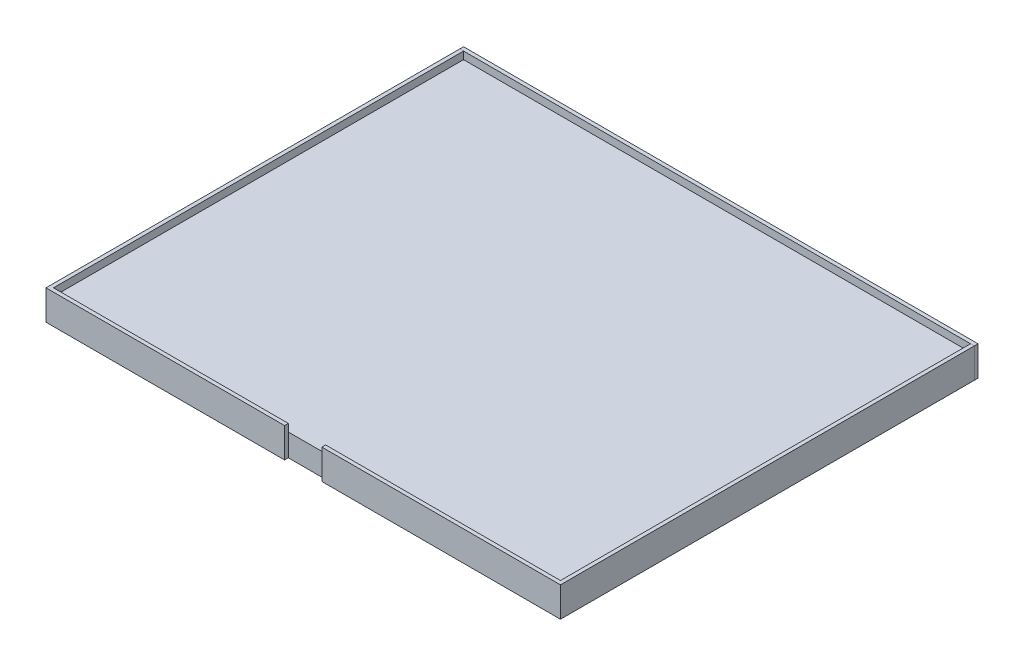
ISO-10303-21;
HEADER;
FILE_DESCRIPTION(('STEP AP214'),'2;1');
FILE_NAME('part.step','',(''),(''),'','','');
FILE_SCHEMA(('AUTOMOTIVE_DESIGN { 1 0 10303 214 1 1 1 1 }'));
ENDSEC;
DATA;
#1=APPLICATION_CONTEXT('core data for automotive mechanical design processes');
#2=APPLICATION_PROTOCOL_DEFINITION('international standard','automotive_design',2000,#1);
#3=PRODUCT_CONTEXT('',#1,'mechanical');
#4=PRODUCT('Part','Part','',(#3));
#5=PRODUCT_RELATED_PRODUCT_CATEGORY('part','',(#4));
#6=PRODUCT_DEFINITION_FORMATION('','',#4);
#7=PRODUCT_DEFINITION_CONTEXT('part definition',#1,'design');
#8=PRODUCT_DEFINITION('design','',#6,#7);
#9=PRODUCT_DEFINITION_SHAPE('','',#8);
#10=(LENGTH_UNIT() NAMED_UNIT(*) SI_UNIT(.MILLI.,.METRE.));
#11=(NAMED_UNIT(*) PLANE_ANGLE_UNIT() SI_UNIT($,.RADIAN.));
#12=(NAMED_UNIT(*) SI_UNIT($,.STERADIAN.) SOLID_ANGLE_UNIT());
#13=UNCERTAINTY_MEASURE_WITH_UNIT(LENGTH_MEASURE(1.E-05),#10,'distance_accuracy_value','');
#14=(GEOMETRIC_REPRESENTATION_CONTEXT(3) GLOBAL_UNCERTAINTY_ASSIGNED_CONTEXT((#13)) GLOBAL_UNIT_ASSIGNED_CONTEXT((#10,
#11,#12)) REPRESENTATION_CONTEXT('',''));
#15=CARTESIAN_POINT('',(0.,0.,0.));
#16=DIRECTION('',(0.,0.,1.));
#17=DIRECTION('',(1.,0.,0.));
#18=AXIS2_PLACEMENT_3D('',#15,#16,#17);
#19=CARTESIAN_POINT('',(434.975,25.4,-352.425));
#20=DIRECTION('',(-1.,0.,0.));
#21=DIRECTION('',(0.,0.,1.));
#22=AXIS2_PLACEMENT_3D('',#19,#20,#21);
#23=PLANE('',#22);
#24=DIRECTION('',(0.,-1.,0.));
#25=VECTOR('',#24,1.);
#26=CARTESIAN_POINT('',(434.975,25.4,-349.25));
#27=LINE('',#26,#25);
#28=CARTESIAN_POINT('',(434.975,25.4,-349.25));
#29=VERTEX_POINT('',#28);
#30=CARTESIAN_POINT('',(434.975,0.,-349.25));
#31=VERTEX_POINT('',#30);
#32=EDGE_CURVE('E127',#29,#31,#27,.T.);
#33=ORIENTED_EDGE('',*,*,#32,.T.);
#34=DIRECTION('',(0.,0.,1.));
#35=VECTOR('',#34,1.);
#36=CARTESIAN_POINT('',(434.975,0.,-352.425));
#37=LINE('',#36,#35);
#38=CARTESIAN_POINT('',(434.975,0.,-352.425));
#39=VERTEX_POINT('',#38);
#40=EDGE_CURVE('E12',#39,#31,#37,.T.);
#41=ORIENTED_EDGE('',*,*,#40,.F.);
#42=DIRECTION('',(0.,-1.,0.));
#43=VECTOR('',#42,1.);
#44=CARTESIAN_POINT('',(434.975,25.4,-352.425));
#45=LINE('',#44,#43);
#46=CARTESIAN_POINT('',(434.975,25.4,-352.425));
#47=VERTEX_POINT('',#46);
#48=EDGE_CURVE('E109',#47,#39,#45,.T.);
#49=ORIENTED_EDGE('',*,*,#48,.F.);
#50=DIRECTION('',(0.,0.,1.));
#51=VECTOR('',#50,1.);
#52=CARTESIAN_POINT('',(434.975,25.4,-352.425));
#53=LINE('',#52,#51);
#54=EDGE_CURVE('E123',#47,#29,#53,.T.);
#55=ORIENTED_EDGE('',*,*,#54,.T.);
#56=EDGE_LOOP('',(#33,#41,#49,#55));
#57=FACE_BOUND('',#56,.T.);
#58=ADVANCED_FACE('F49',(#57),#23,.F.);
#59=CARTESIAN_POINT('',(434.975,0.,-352.425));
#60=DIRECTION('',(0.,1.,0.));
#61=DIRECTION('',(0.,0.,1.));
#62=AXIS2_PLACEMENT_3D('',#59,#60,#61);
#63=PLANE('',#62);
#64=DIRECTION('',(-1.,0.,0.));
#65=VECTOR('',#64,1.);
#66=CARTESIAN_POINT('',(434.975,0.,-349.25));
#67=LINE('',#66,#65);
#68=CARTESIAN_POINT('',(-3.175,0.,-349.25));
#69=VERTEX_POINT('',#68);
#70=EDGE_CURVE('E114',#31,#69,#67,.T.);
#71=ORIENTED_EDGE('',*,*,#70,.T.);
#72=DIRECTION('',(0.,0.,1.));
#73=VECTOR('',#72,1.);
#74=CARTESIAN_POINT('',(-3.175,0.,-352.425));
#75=LINE('',#74,#73);
#76=CARTESIAN_POINT('',(-3.175,0.,-352.425));
#77=VERTEX_POINT('',#76);
#78=EDGE_CURVE('E58',#77,#69,#75,.T.);
#79=ORIENTED_EDGE('',*,*,#78,.F.);
#80=DIRECTION('',(-1.,0.,0.));
#81=VECTOR('',#80,1.);
#82=CARTESIAN_POINT('',(434.975,0.,-352.425));
#83=LINE('',#82,#81);
#84=EDGE_CURVE('E104',#39,#77,#83,.T.);
#85=ORIENTED_EDGE('',*,*,#84,.F.);
#86=ORIENTED_EDGE('',*,*,#40,.T.);
#87=EDGE_LOOP('',(#71,#79,#85,#86));
#88=FACE_BOUND('',#87,.T.);
#89=ADVANCED_FACE('F113',(#88),#63,.F.);
#90=CARTESIAN_POINT('',(-3.175,25.4,-352.425));
#91=DIRECTION('',(1.,0.,0.));
#92=DIRECTION('',(0.,0.,-1.));
#93=AXIS2_PLACEMENT_3D('',#90,#91,#92);
#94=PLANE('',#93);
#95=DIRECTION('',(0.,1.,0.));
#96=VECTOR('',#95,1.);
#97=CARTESIAN_POINT('',(-3.175,25.4,-349.25));
#98=LINE('',#97,#96);
#99=CARTESIAN_POINT('',(-3.175,25.4,-349.25));
#100=VERTEX_POINT('',#99);
#101=EDGE_CURVE('E90',#69,#100,#98,.T.);
#102=ORIENTED_EDGE('',*,*,#101,.T.);
#103=DIRECTION('',(0.,0.,1.));
#104=VECTOR('',#103,1.);
#105=CARTESIAN_POINT('',(-3.175,25.4,-352.425));
#106=LINE('',#105,#104);
#107=CARTESIAN_POINT('',(-3.175,25.4,-352.425));
#108=VERTEX_POINT('',#107);
#109=EDGE_CURVE('E116',#108,#100,#106,.T.);
#110=ORIENTED_EDGE('',*,*,#109,.F.);
#111=DIRECTION('',(0.,1.,0.));
#112=VECTOR('',#111,1.);
#113=CARTESIAN_POINT('',(-3.175,25.4,-352.425));
#114=LINE('',#113,#112);
#115=EDGE_CURVE('E107',#77,#108,#114,.T.);
#116=ORIENTED_EDGE('',*,*,#115,.F.);
#117=ORIENTED_EDGE('',*,*,#78,.T.);
#118=EDGE_LOOP('',(#102,#110,#116,#117));
#119=FACE_BOUND('',#118,.T.);
#120=ADVANCED_FACE('F117',(#119),#94,.F.);
#121=CARTESIAN_POINT('',(434.975,25.4,-352.425));
#122=DIRECTION('',(0.,-1.,0.));
#123=DIRECTION('',(0.,0.,-1.));
#124=AXIS2_PLACEMENT_3D('',#121,#122,#123);
#125=PLANE('',#124);
#126=DIRECTION('',(1.,0.,0.));
#127=VECTOR('',#126,1.);
#128=CARTESIAN_POINT('',(434.975,25.4,-349.25));
#129=LINE('',#128,#127);
#130=EDGE_CURVE('E97',#100,#29,#129,.T.);
#131=ORIENTED_EDGE('',*,*,#130,.T.);
#132=ORIENTED_EDGE('',*,*,#54,.F.);
#133=DIRECTION('',(1.,0.,0.));
#134=VECTOR('',#133,1.);
#135=CARTESIAN_POINT('',(434.975,25.4,-352.425));
#136=LINE('',#135,#134);
#137=EDGE_CURVE('E69',#108,#47,#136,.T.);
#138=ORIENTED_EDGE('',*,*,#137,.F.);
#139=ORIENTED_EDGE('',*,*,#109,.T.);
#140=EDGE_LOOP('',(#131,#132,#138,#139));
#141=FACE_BOUND('',#140,.T.);
#142=ADVANCED_FACE('F139',(#141),#125,.F.);
#143=CARTESIAN_POINT('',(0.,0.,-352.425));
#144=DIRECTION('',(0.,0.,-1.));
#145=DIRECTION('',(-1.,0.,0.));
#146=AXIS2_PLACEMENT_3D('',#143,#144,#145);
#147=PLANE('',#146);
#148=ORIENTED_EDGE('',*,*,#48,.T.);
#149=ORIENTED_EDGE('',*,*,#84,.T.);
#150=ORIENTED_EDGE('',*,*,#115,.T.);
#151=ORIENTED_EDGE('',*,*,#137,.T.);
#152=EDGE_LOOP('',(#148,#149,#150,#151));
#153=FACE_BOUND('',#152,.T.);
#154=ADVANCED_FACE('F105',(#153),#147,.T.);
#155=CARTESIAN_POINT('',(0.,0.,-349.25));
#156=DIRECTION('',(0.,0.,-1.));
#157=DIRECTION('',(-1.,0.,0.));
#158=AXIS2_PLACEMENT_3D('',#155,#156,#157);
#159=PLANE('',#158);
#160=ORIENTED_EDGE('',*,*,#32,.F.);
#161=ORIENTED_EDGE('',*,*,#130,.F.);
#162=ORIENTED_EDGE('',*,*,#101,.F.);
#163=ORIENTED_EDGE('',*,*,#70,.F.);
#164=EDGE_LOOP('',(#160,#161,#162,#163));
#165=FACE_BOUND('',#164,.T.);
#166=ADVANCED_FACE('F142',(#165),#159,.F.);
#167=CLOSED_SHELL('',(#58,#89,#120,#142,#154,#166));
#168=MANIFOLD_SOLID_BREP('B2',#167);
#169=CARTESIAN_POINT('',(-3.175,25.4,3.175));
#170=DIRECTION('',(0.,0.,1.));
#171=DIRECTION('',(1.,0.,0.));
#172=AXIS2_PLACEMENT_3D('',#169,#170,#171);
#173=PLANE('',#172);
#174=DIRECTION('',(0.,1.,0.));
#175=VECTOR('',#174,1.);
#176=CARTESIAN_POINT('',(231.775,0.,3.175));
#177=LINE('',#176,#175);
#178=CARTESIAN_POINT('',(231.775,0.,3.175));
#179=VERTEX_POINT('',#178);
#180=CARTESIAN_POINT('',(231.775,25.4,3.175));
#181=VERTEX_POINT('',#180);
#182=EDGE_CURVE('E216',#179,#181,#177,.T.);
#183=ORIENTED_EDGE('',*,*,#182,.F.);
#184=DIRECTION('',(-1.,0.,0.));
#185=VECTOR('',#184,1.);
#186=CARTESIAN_POINT('',(-3.175,0.,3.175));
#187=LINE('',#186,#185);
#188=CARTESIAN_POINT('',(434.975,0.,3.175));
#189=VERTEX_POINT('',#188);
#190=EDGE_CURVE('E290',#189,#179,#187,.T.);
#191=ORIENTED_EDGE('',*,*,#190,.F.);
#192=DIRECTION('',(0.,-1.,0.));
#193=VECTOR('',#192,1.);
#194=CARTESIAN_POINT('',(434.975,25.4,3.175));
#195=LINE('',#194,#193);
#196=CARTESIAN_POINT('',(434.975,25.4,3.175));
#197=VERTEX_POINT('',#196);
#198=EDGE_CURVE('E275',#197,#189,#195,.T.);
#199=ORIENTED_EDGE('',*,*,#198,.F.);
#200=DIRECTION('',(-1.,0.,0.));
#201=VECTOR('',#200,1.);
#202=CARTESIAN_POINT('',(-3.175,25.4,3.175));
#203=LINE('',#202,#201);
#204=EDGE_CURVE('E324',#197,#181,#203,.T.);
#205=ORIENTED_EDGE('',*,*,#204,.T.);
#206=EDGE_LOOP('',(#183,#191,#199,#205));
#207=FACE_BOUND('',#206,.T.);
#208=ADVANCED_FACE('F206',(#207),#173,.T.);
#209=CARTESIAN_POINT('',(0.,25.4,0.));
#210=DIRECTION('',(0.,0.,-1.));
#211=DIRECTION('',(-1.,0.,0.));
#212=AXIS2_PLACEMENT_3D('',#209,#210,#211);
#213=PLANE('',#212);
#214=DIRECTION('',(0.,1.,0.));
#215=VECTOR('',#214,1.);
#216=CARTESIAN_POINT('',(231.775,0.,0.));
#217=LINE('',#216,#215);
#218=CARTESIAN_POINT('',(231.775,0.,0.));
#219=VERTEX_POINT('',#218);
#220=CARTESIAN_POINT('',(231.775,25.4,0.));
#221=VERTEX_POINT('',#220);
#222=EDGE_CURVE('E319',#219,#221,#217,.T.);
#223=ORIENTED_EDGE('',*,*,#222,.T.);
#224=DIRECTION('',(1.,0.,0.));
#225=VECTOR('',#224,1.);
#226=CARTESIAN_POINT('',(0.,25.4,0.));
#227=LINE('',#226,#225);
#228=CARTESIAN_POINT('',(431.8,25.4,0.));
#229=VERTEX_POINT('',#228);
#230=EDGE_CURVE('E323',#221,#229,#227,.T.);
#231=ORIENTED_EDGE('',*,*,#230,.T.);
#232=DIRECTION('',(0.,-1.,0.));
#233=VECTOR('',#232,1.);
#234=CARTESIAN_POINT('',(431.8,25.4,0.));
#235=LINE('',#234,#233);
#236=CARTESIAN_POINT('',(431.8,0.,0.));
#237=VERTEX_POINT('',#236);
#238=EDGE_CURVE('E315',#229,#237,#235,.T.);
#239=ORIENTED_EDGE('',*,*,#238,.T.);
#240=DIRECTION('',(1.,0.,0.));
#241=VECTOR('',#240,1.);
#242=CARTESIAN_POINT('',(0.,0.,0.));
#243=LINE('',#242,#241);
#244=EDGE_CURVE('E209',#219,#237,#243,.T.);
#245=ORIENTED_EDGE('',*,*,#244,.F.);
#246=EDGE_LOOP('',(#223,#231,#239,#245));
#247=FACE_BOUND('',#246,.T.);
#248=ADVANCED_FACE('F345',(#247),#213,.T.);
#249=CARTESIAN_POINT('',(0.,25.4,0.));
#250=DIRECTION('',(0.,1.,0.));
#251=DIRECTION('',(0.,0.,1.));
#252=AXIS2_PLACEMENT_3D('',#249,#250,#251);
#253=PLANE('',#252);
#254=DIRECTION('',(0.,0.,1.));
#255=VECTOR('',#254,1.);
#256=CARTESIAN_POINT('',(231.775,25.4,0.));
#257=LINE('',#256,#255);
#258=EDGE_CURVE('E293',#221,#181,#257,.T.);
#259=ORIENTED_EDGE('',*,*,#258,.T.);
#260=ORIENTED_EDGE('',*,*,#204,.F.);
#261=DIRECTION('',(0.,0.,1.));
#262=VECTOR('',#261,1.);
#263=CARTESIAN_POINT('',(434.975,25.4,3.175));
#264=LINE('',#263,#262);
#265=CARTESIAN_POINT('',(434.975,25.4,-349.25));
#266=VERTEX_POINT('',#265);
#267=EDGE_CURVE('E282',#266,#197,#264,.T.);
#268=ORIENTED_EDGE('',*,*,#267,.F.);
#269=DIRECTION('',(1.,0.,0.));
#270=VECTOR('',#269,1.);
#271=CARTESIAN_POINT('',(431.8,25.4,-349.25));
#272=LINE('',#271,#270);
#273=CARTESIAN_POINT('',(431.8,25.4,-349.25));
#274=VERTEX_POINT('',#273);
#275=EDGE_CURVE('E287',#274,#266,#272,.T.);
#276=ORIENTED_EDGE('',*,*,#275,.F.);
#277=DIRECTION('',(0.,0.,-1.));
#278=VECTOR('',#277,1.);
#279=CARTESIAN_POINT('',(431.8,25.4,0.));
#280=LINE('',#279,#278);
#281=EDGE_CURVE('E312',#229,#274,#280,.T.);
#282=ORIENTED_EDGE('',*,*,#281,.F.);
#283=ORIENTED_EDGE('',*,*,#230,.F.);
#284=EDGE_LOOP('',(#259,#260,#268,#276,#282,#283));
#285=FACE_BOUND('',#284,.T.);
#286=ADVANCED_FACE('F342',(#285),#253,.T.);
#287=CARTESIAN_POINT('',(0.,0.,0.));
#288=DIRECTION('',(0.,1.,0.));
#289=DIRECTION('',(0.,0.,1.));
#290=AXIS2_PLACEMENT_3D('',#287,#288,#289);
#291=PLANE('',#290);
#292=ORIENTED_EDGE('',*,*,#190,.T.);
#293=DIRECTION('',(0.,0.,1.));
#294=VECTOR('',#293,1.);
#295=CARTESIAN_POINT('',(231.775,0.,0.));
#296=LINE('',#295,#294);
#297=EDGE_CURVE('E47',#219,#179,#296,.T.);
#298=ORIENTED_EDGE('',*,*,#297,.F.);
#299=ORIENTED_EDGE('',*,*,#244,.T.);
#300=DIRECTION('',(0.,0.,-1.));
#301=VECTOR('',#300,1.);
#302=CARTESIAN_POINT('',(431.8,0.,0.));
#303=LINE('',#302,#301);
#304=CARTESIAN_POINT('',(431.8,0.,-349.25));
#305=VERTEX_POINT('',#304);
#306=EDGE_CURVE('E304',#237,#305,#303,.T.);
#307=ORIENTED_EDGE('',*,*,#306,.T.);
#308=DIRECTION('',(1.,0.,0.));
#309=VECTOR('',#308,1.);
#310=CARTESIAN_POINT('',(431.8,0.,-349.25));
#311=LINE('',#310,#309);
#312=CARTESIAN_POINT('',(434.975,0.,-349.25));
#313=VERTEX_POINT('',#312);
#314=EDGE_CURVE('E296',#305,#313,#311,.T.);
#315=ORIENTED_EDGE('',*,*,#314,.T.);
#316=DIRECTION('',(0.,0.,1.));
#317=VECTOR('',#316,1.);
#318=CARTESIAN_POINT('',(434.975,0.,3.175));
#319=LINE('',#318,#317);
#320=EDGE_CURVE('E279',#313,#189,#319,.T.);
#321=ORIENTED_EDGE('',*,*,#320,.T.);
#322=EDGE_LOOP('',(#292,#298,#299,#307,#315,#321));
#323=FACE_BOUND('',#322,.T.);
#324=ADVANCED_FACE('F294',(#323),#291,.F.);
#325=CARTESIAN_POINT('',(434.975,25.4,3.175));
#326=DIRECTION('',(1.,0.,0.));
#327=DIRECTION('',(0.,0.,-1.));
#328=AXIS2_PLACEMENT_3D('',#325,#326,#327);
#329=PLANE('',#328);
#330=ORIENTED_EDGE('',*,*,#320,.F.);
#331=DIRECTION('',(0.,-1.,0.));
#332=VECTOR('',#331,1.);
#333=CARTESIAN_POINT('',(434.975,25.4,-349.25));
#334=LINE('',#333,#332);
#335=EDGE_CURVE('E311',#266,#313,#334,.T.);
#336=ORIENTED_EDGE('',*,*,#335,.F.);
#337=ORIENTED_EDGE('',*,*,#267,.T.);
#338=ORIENTED_EDGE('',*,*,#198,.T.);
#339=EDGE_LOOP('',(#330,#336,#337,#338));
#340=FACE_BOUND('',#339,.T.);
#341=ADVANCED_FACE('F277',(#340),#329,.T.);
#342=CARTESIAN_POINT('',(431.8,25.4,-349.25));
#343=DIRECTION('',(0.,0.,-1.));
#344=DIRECTION('',(-1.,0.,0.));
#345=AXIS2_PLACEMENT_3D('',#342,#343,#344);
#346=PLANE('',#345);
#347=ORIENTED_EDGE('',*,*,#314,.F.);
#348=DIRECTION('',(0.,-1.,0.));
#349=VECTOR('',#348,1.);
#350=CARTESIAN_POINT('',(431.8,25.4,-349.25));
#351=LINE('',#350,#349);
#352=EDGE_CURVE('E247',#274,#305,#351,.T.);
#353=ORIENTED_EDGE('',*,*,#352,.F.);
#354=ORIENTED_EDGE('',*,*,#275,.T.);
#355=ORIENTED_EDGE('',*,*,#335,.T.);
#356=EDGE_LOOP('',(#347,#353,#354,#355));
#357=FACE_BOUND('',#356,.T.);
#358=ADVANCED_FACE('F340',(#357),#346,.T.);
#359=CARTESIAN_POINT('',(431.8,25.4,0.));
#360=DIRECTION('',(-1.,0.,0.));
#361=DIRECTION('',(0.,0.,1.));
#362=AXIS2_PLACEMENT_3D('',#359,#360,#361);
#363=PLANE('',#362);
#364=ORIENTED_EDGE('',*,*,#306,.F.);
#365=ORIENTED_EDGE('',*,*,#238,.F.);
#366=ORIENTED_EDGE('',*,*,#281,.T.);
#367=ORIENTED_EDGE('',*,*,#352,.T.);
#368=EDGE_LOOP('',(#364,#365,#366,#367));
#369=FACE_BOUND('',#368,.T.);
#370=ADVANCED_FACE('F346',(#369),#363,.T.);
#371=CARTESIAN_POINT('',(231.775,0.,0.));
#372=DIRECTION('',(1.,0.,0.));
#373=DIRECTION('',(0.,1.,0.));
#374=AXIS2_PLACEMENT_3D('',#371,#372,#373);
#375=PLANE('',#374);
#376=ORIENTED_EDGE('',*,*,#182,.T.);
#377=ORIENTED_EDGE('',*,*,#258,.F.);
#378=ORIENTED_EDGE('',*,*,#222,.F.);
#379=ORIENTED_EDGE('',*,*,#297,.T.);
#380=EDGE_LOOP('',(#376,#377,#378,#379));
#381=FACE_BOUND('',#380,.T.);
#382=ADVANCED_FACE('F344',(#381),#375,.F.);
#383=CLOSED_SHELL('',(#208,#248,#286,#324,#341,#358,#370,#382));
#384=MANIFOLD_SOLID_BREP('B6',#383);
#385=CARTESIAN_POINT('',(0.,25.4,-349.25));
#386=DIRECTION('',(1.,0.,0.));
#387=DIRECTION('',(0.,0.,-1.));
#388=AXIS2_PLACEMENT_3D('',#385,#386,#387);
#389=PLANE('',#388);
#390=DIRECTION('',(0.,0.,1.));
#391=VECTOR('',#390,1.);
#392=CARTESIAN_POINT('',(0.,0.,-349.25));
#393=LINE('',#392,#391);
#394=CARTESIAN_POINT('',(0.,0.,-349.25));
#395=VERTEX_POINT('',#394);
#396=CARTESIAN_POINT('',(0.,0.,0.));
#397=VERTEX_POINT('',#396);
#398=EDGE_CURVE('E537',#395,#397,#393,.T.);
#399=ORIENTED_EDGE('',*,*,#398,.F.);
#400=DIRECTION('',(0.,-1.,0.));
#401=VECTOR('',#400,1.);
#402=CARTESIAN_POINT('',(0.,25.4,-349.25));
#403=LINE('',#402,#401);
#404=CARTESIAN_POINT('',(0.,25.4,-349.25));
#405=VERTEX_POINT('',#404);
#406=EDGE_CURVE('E429',#405,#395,#403,.T.);
#407=ORIENTED_EDGE('',*,*,#406,.F.);
#408=DIRECTION('',(0.,0.,1.));
#409=VECTOR('',#408,1.);
#410=CARTESIAN_POINT('',(0.,25.4,-349.25));
#411=LINE('',#410,#409);
#412=CARTESIAN_POINT('',(0.,25.4,0.));
#413=VERTEX_POINT('',#412);
#414=EDGE_CURVE('E520',#405,#413,#411,.T.);
#415=ORIENTED_EDGE('',*,*,#414,.T.);
#416=DIRECTION('',(0.,-1.,0.));
#417=VECTOR('',#416,1.);
#418=CARTESIAN_POINT('',(0.,25.4,0.));
#419=LINE('',#418,#417);
#420=EDGE_CURVE('E518',#413,#397,#419,.T.);
#421=ORIENTED_EDGE('',*,*,#420,.T.);
#422=EDGE_LOOP('',(#399,#407,#415,#421));
#423=FACE_BOUND('',#422,.T.);
#424=ADVANCED_FACE('F425',(#423),#389,.T.);
#425=CARTESIAN_POINT('',(0.,25.4,-349.25));
#426=DIRECTION('',(0.,0.,-1.));
#427=DIRECTION('',(-1.,0.,0.));
#428=AXIS2_PLACEMENT_3D('',#425,#426,#427);
#429=PLANE('',#428);
#430=DIRECTION('',(1.,0.,0.));
#431=VECTOR('',#430,1.);
#432=CARTESIAN_POINT('',(0.,0.,-349.25));
#433=LINE('',#432,#431);
#434=CARTESIAN_POINT('',(-3.175,0.,-349.25));
#435=VERTEX_POINT('',#434);
#436=EDGE_CURVE('E533',#435,#395,#433,.T.);
#437=ORIENTED_EDGE('',*,*,#436,.F.);
#438=DIRECTION('',(0.,-1.,0.));
#439=VECTOR('',#438,1.);
#440=CARTESIAN_POINT('',(-3.175,25.4,-349.25));
#441=LINE('',#440,#439);
#442=CARTESIAN_POINT('',(-3.175,25.4,-349.25));
#443=VERTEX_POINT('',#442);
#444=EDGE_CURVE('E204',#443,#435,#441,.T.);
#445=ORIENTED_EDGE('',*,*,#444,.F.);
#446=DIRECTION('',(1.,0.,0.));
#447=VECTOR('',#446,1.);
#448=CARTESIAN_POINT('',(0.,25.4,-349.25));
#449=LINE('',#448,#447);
#450=EDGE_CURVE('E527',#443,#405,#449,.T.);
#451=ORIENTED_EDGE('',*,*,#450,.T.);
#452=ORIENTED_EDGE('',*,*,#406,.T.);
#453=EDGE_LOOP('',(#437,#445,#451,#452));
#454=FACE_BOUND('',#453,.T.);
#455=ADVANCED_FACE('F427',(#454),#429,.T.);
#456=CARTESIAN_POINT('',(-3.175,25.4,-349.25));
#457=DIRECTION('',(-1.,0.,0.));
#458=DIRECTION('',(0.,0.,1.));
#459=AXIS2_PLACEMENT_3D('',#456,#457,#458);
#460=PLANE('',#459);
#461=DIRECTION('',(0.,0.,-1.));
#462=VECTOR('',#461,1.);
#463=CARTESIAN_POINT('',(-3.175,0.,-349.25));
#464=LINE('',#463,#462);
#465=CARTESIAN_POINT('',(-3.175,0.,3.175));
#466=VERTEX_POINT('',#465);
#467=EDGE_CURVE('E547',#466,#435,#464,.T.);
#468=ORIENTED_EDGE('',*,*,#467,.F.);
#469=DIRECTION('',(0.,-1.,0.));
#470=VECTOR('',#469,1.);
#471=CARTESIAN_POINT('',(-3.175,25.4,3.175));
#472=LINE('',#471,#470);
#473=CARTESIAN_POINT('',(-3.175,25.4,3.175));
#474=VERTEX_POINT('',#473);
#475=EDGE_CURVE('E435',#474,#466,#472,.T.);
#476=ORIENTED_EDGE('',*,*,#475,.F.);
#477=DIRECTION('',(0.,0.,-1.));
#478=VECTOR('',#477,1.);
#479=CARTESIAN_POINT('',(-3.175,25.4,-349.25));
#480=LINE('',#479,#478);
#481=EDGE_CURVE('E524',#474,#443,#480,.T.);
#482=ORIENTED_EDGE('',*,*,#481,.T.);
#483=ORIENTED_EDGE('',*,*,#444,.T.);
#484=EDGE_LOOP('',(#468,#476,#482,#483));
#485=FACE_BOUND('',#484,.T.);
#486=ADVANCED_FACE('F560',(#485),#460,.T.);
#487=CARTESIAN_POINT('',(0.,25.4,0.));
#488=DIRECTION('',(0.,1.,0.));
#489=DIRECTION('',(0.,0.,1.));
#490=AXIS2_PLACEMENT_3D('',#487,#488,#489);
#491=PLANE('',#490);
#492=DIRECTION('',(0.,0.,1.));
#493=VECTOR('',#492,1.);
#494=CARTESIAN_POINT('',(200.025,25.4,0.));
#495=LINE('',#494,#493);
#496=CARTESIAN_POINT('',(200.025,25.4,0.));
#497=VERTEX_POINT('',#496);
#498=CARTESIAN_POINT('',(200.025,25.4,3.175));
#499=VERTEX_POINT('',#498);
#500=EDGE_CURVE('E500',#497,#499,#495,.T.);
#501=ORIENTED_EDGE('',*,*,#500,.F.);
#502=DIRECTION('',(1.,0.,0.));
#503=VECTOR('',#502,1.);
#504=CARTESIAN_POINT('',(0.,25.4,0.));
#505=LINE('',#504,#503);
#506=EDGE_CURVE('E512',#413,#497,#505,.T.);
#507=ORIENTED_EDGE('',*,*,#506,.F.);
#508=ORIENTED_EDGE('',*,*,#414,.F.);
#509=ORIENTED_EDGE('',*,*,#450,.F.);
#510=ORIENTED_EDGE('',*,*,#481,.F.);
#511=DIRECTION('',(-1.,0.,0.));
#512=VECTOR('',#511,1.);
#513=CARTESIAN_POINT('',(-3.175,25.4,3.175));
#514=LINE('',#513,#512);
#515=EDGE_CURVE('E514',#499,#474,#514,.T.);
#516=ORIENTED_EDGE('',*,*,#515,.F.);
#517=EDGE_LOOP('',(#501,#507,#508,#509,#510,#516));
#518=FACE_BOUND('',#517,.T.);
#519=ADVANCED_FACE('F511',(#518),#491,.T.);
#520=CARTESIAN_POINT('',(0.,0.,0.));
#521=DIRECTION('',(0.,1.,0.));
#522=DIRECTION('',(0.,0.,1.));
#523=AXIS2_PLACEMENT_3D('',#520,#521,#522);
#524=PLANE('',#523);
#525=DIRECTION('',(1.,0.,0.));
#526=VECTOR('',#525,1.);
#527=CARTESIAN_POINT('',(0.,0.,0.));
#528=LINE('',#527,#526);
#529=CARTESIAN_POINT('',(200.025,0.,0.));
#530=VERTEX_POINT('',#529);
#531=EDGE_CURVE('E541',#397,#530,#528,.T.);
#532=ORIENTED_EDGE('',*,*,#531,.T.);
#533=DIRECTION('',(0.,0.,1.));
#534=VECTOR('',#533,1.);
#535=CARTESIAN_POINT('',(200.025,0.,0.));
#536=LINE('',#535,#534);
#537=CARTESIAN_POINT('',(200.025,0.,3.175));
#538=VERTEX_POINT('',#537);
#539=EDGE_CURVE('E501',#530,#538,#536,.T.);
#540=ORIENTED_EDGE('',*,*,#539,.T.);
#541=DIRECTION('',(-1.,0.,0.));
#542=VECTOR('',#541,1.);
#543=CARTESIAN_POINT('',(-3.175,0.,3.175));
#544=LINE('',#543,#542);
#545=EDGE_CURVE('E544',#538,#466,#544,.T.);
#546=ORIENTED_EDGE('',*,*,#545,.T.);
#547=ORIENTED_EDGE('',*,*,#467,.T.);
#548=ORIENTED_EDGE('',*,*,#436,.T.);
#549=ORIENTED_EDGE('',*,*,#398,.T.);
#550=EDGE_LOOP('',(#532,#540,#546,#547,#548,#549));
#551=FACE_BOUND('',#550,.T.);
#552=ADVANCED_FACE('F557',(#551),#524,.F.);
#553=CARTESIAN_POINT('',(0.,25.4,0.));
#554=DIRECTION('',(0.,0.,-1.));
#555=DIRECTION('',(-1.,0.,0.));
#556=AXIS2_PLACEMENT_3D('',#553,#554,#555);
#557=PLANE('',#556);
#558=DIRECTION('',(0.,-1.,0.));
#559=VECTOR('',#558,1.);
#560=CARTESIAN_POINT('',(200.025,0.,0.));
#561=LINE('',#560,#559);
#562=EDGE_CURVE('E497',#497,#530,#561,.T.);
#563=ORIENTED_EDGE('',*,*,#562,.T.);
#564=ORIENTED_EDGE('',*,*,#531,.F.);
#565=ORIENTED_EDGE('',*,*,#420,.F.);
#566=ORIENTED_EDGE('',*,*,#506,.T.);
#567=EDGE_LOOP('',(#563,#564,#565,#566));
#568=FACE_BOUND('',#567,.T.);
#569=ADVANCED_FACE('F517',(#568),#557,.T.);
#570=CARTESIAN_POINT('',(-3.175,25.4,3.175));
#571=DIRECTION('',(0.,0.,1.));
#572=DIRECTION('',(1.,0.,0.));
#573=AXIS2_PLACEMENT_3D('',#570,#571,#572);
#574=PLANE('',#573);
#575=DIRECTION('',(0.,-1.,0.));
#576=VECTOR('',#575,1.);
#577=CARTESIAN_POINT('',(200.025,0.,3.175));
#578=LINE('',#577,#576);
#579=EDGE_CURVE('E446',#499,#538,#578,.T.);
#580=ORIENTED_EDGE('',*,*,#579,.F.);
#581=ORIENTED_EDGE('',*,*,#515,.T.);
#582=ORIENTED_EDGE('',*,*,#475,.T.);
#583=ORIENTED_EDGE('',*,*,#545,.F.);
#584=EDGE_LOOP('',(#580,#581,#582,#583));
#585=FACE_BOUND('',#584,.T.);
#586=ADVANCED_FACE('F565',(#585),#574,.T.);
#587=CARTESIAN_POINT('',(200.025,0.,0.));
#588=DIRECTION('',(-1.,0.,0.));
#589=DIRECTION('',(0.,-1.,0.));
#590=AXIS2_PLACEMENT_3D('',#587,#588,#589);
#591=PLANE('',#590);
#592=ORIENTED_EDGE('',*,*,#579,.T.);
#593=ORIENTED_EDGE('',*,*,#539,.F.);
#594=ORIENTED_EDGE('',*,*,#562,.F.);
#595=ORIENTED_EDGE('',*,*,#500,.T.);
#596=EDGE_LOOP('',(#592,#593,#594,#595));
#597=FACE_BOUND('',#596,.T.);
#598=ADVANCED_FACE('F499',(#597),#591,.F.);
#599=CLOSED_SHELL('',(#424,#455,#486,#519,#552,#569,#586,#598));
#600=MANIFOLD_SOLID_BREP('B41',#599);
#601=CARTESIAN_POINT('',(0.,19.05,0.));
#602=DIRECTION('',(1.,0.,0.));
#603=DIRECTION('',(0.,0.,-1.));
#604=AXIS2_PLACEMENT_3D('',#601,#602,#603);
#605=PLANE('',#604);
#606=DIRECTION('',(0.,0.,1.));
#607=VECTOR('',#606,1.);
#608=CARTESIAN_POINT('',(0.,0.,0.));
#609=LINE('',#608,#607);
#610=CARTESIAN_POINT('',(0.,0.,-349.25));
#611=VERTEX_POINT('',#610);
#612=CARTESIAN_POINT('',(0.,0.,0.));
#613=VERTEX_POINT('',#612);
#614=EDGE_CURVE('E715',#611,#613,#609,.T.);
#615=ORIENTED_EDGE('',*,*,#614,.T.);
#616=DIRECTION('',(0.,-1.,0.));
#617=VECTOR('',#616,1.);
#618=CARTESIAN_POINT('',(0.,19.05,0.));
#619=LINE('',#618,#617);
#620=CARTESIAN_POINT('',(0.,19.05,0.));
#621=VERTEX_POINT('',#620);
#622=EDGE_CURVE('E423',#621,#613,#619,.T.);
#623=ORIENTED_EDGE('',*,*,#622,.F.);
#624=DIRECTION('',(0.,0.,1.));
#625=VECTOR('',#624,1.);
#626=CARTESIAN_POINT('',(0.,19.05,0.));
#627=LINE('',#626,#625);
#628=CARTESIAN_POINT('',(0.,19.05,-349.25));
#629=VERTEX_POINT('',#628);
#630=EDGE_CURVE('E698',#629,#621,#627,.T.);
#631=ORIENTED_EDGE('',*,*,#630,.F.);
#632=DIRECTION('',(0.,-1.,0.));
#633=VECTOR('',#632,1.);
#634=CARTESIAN_POINT('',(0.,19.05,-349.25));
#635=LINE('',#634,#633);
#636=EDGE_CURVE('E711',#629,#611,#635,.T.);
#637=ORIENTED_EDGE('',*,*,#636,.T.);
#638=EDGE_LOOP('',(#615,#623,#631,#637));
#639=FACE_BOUND('',#638,.T.);
#640=ADVANCED_FACE('F638',(#639),#605,.F.);
#641=CARTESIAN_POINT('',(0.,19.05,0.));
#642=DIRECTION('',(0.,0.,-1.));
#643=DIRECTION('',(-1.,0.,0.));
#644=AXIS2_PLACEMENT_3D('',#641,#642,#643);
#645=PLANE('',#644);
#646=DIRECTION('',(1.,0.,0.));
#647=VECTOR('',#646,1.);
#648=CARTESIAN_POINT('',(0.,0.,0.));
#649=LINE('',#648,#647);
#650=CARTESIAN_POINT('',(431.8,0.,0.));
#651=VERTEX_POINT('',#650);
#652=EDGE_CURVE('E703',#613,#651,#649,.T.);
#653=ORIENTED_EDGE('',*,*,#652,.T.);
#654=DIRECTION('',(0.,-1.,0.));
#655=VECTOR('',#654,1.);
#656=CARTESIAN_POINT('',(431.8,19.05,0.));
#657=LINE('',#656,#655);
#658=CARTESIAN_POINT('',(431.8,19.05,0.));
#659=VERTEX_POINT('',#658);
#660=EDGE_CURVE('E647',#659,#651,#657,.T.);
#661=ORIENTED_EDGE('',*,*,#660,.F.);
#662=DIRECTION('',(1.,0.,0.));
#663=VECTOR('',#662,1.);
#664=CARTESIAN_POINT('',(0.,19.05,0.));
#665=LINE('',#664,#663);
#666=EDGE_CURVE('E693',#621,#659,#665,.T.);
#667=ORIENTED_EDGE('',*,*,#666,.F.);
#668=ORIENTED_EDGE('',*,*,#622,.T.);
#669=EDGE_LOOP('',(#653,#661,#667,#668));
#670=FACE_BOUND('',#669,.T.);
#671=ADVANCED_FACE('F702',(#670),#645,.F.);
#672=CARTESIAN_POINT('',(431.8,19.05,0.));
#673=DIRECTION('',(-1.,0.,0.));
#674=DIRECTION('',(0.,0.,1.));
#675=AXIS2_PLACEMENT_3D('',#672,#673,#674);
#676=PLANE('',#675);
#677=DIRECTION('',(0.,0.,-1.));
#678=VECTOR('',#677,1.);
#679=CARTESIAN_POINT('',(431.8,0.,0.));
#680=LINE('',#679,#678);
#681=CARTESIAN_POINT('',(431.8,0.,-349.25));
#682=VERTEX_POINT('',#681);
#683=EDGE_CURVE('E679',#651,#682,#680,.T.);
#684=ORIENTED_EDGE('',*,*,#683,.T.);
#685=DIRECTION('',(0.,-1.,0.));
#686=VECTOR('',#685,1.);
#687=CARTESIAN_POINT('',(431.8,19.05,-349.25));
#688=LINE('',#687,#686);
#689=CARTESIAN_POINT('',(431.8,19.05,-349.25));
#690=VERTEX_POINT('',#689);
#691=EDGE_CURVE('E705',#690,#682,#688,.T.);
#692=ORIENTED_EDGE('',*,*,#691,.F.);
#693=DIRECTION('',(0.,0.,-1.));
#694=VECTOR('',#693,1.);
#695=CARTESIAN_POINT('',(431.8,19.05,0.));
#696=LINE('',#695,#694);
#697=EDGE_CURVE('E696',#659,#690,#696,.T.);
#698=ORIENTED_EDGE('',*,*,#697,.F.);
#699=ORIENTED_EDGE('',*,*,#660,.T.);
#700=EDGE_LOOP('',(#684,#692,#698,#699));
#701=FACE_BOUND('',#700,.T.);
#702=ADVANCED_FACE('F706',(#701),#676,.F.);
#703=CARTESIAN_POINT('',(0.,19.05,-349.25));
#704=DIRECTION('',(0.,0.,1.));
#705=DIRECTION('',(1.,0.,0.));
#706=AXIS2_PLACEMENT_3D('',#703,#704,#705);
#707=PLANE('',#706);
#708=DIRECTION('',(-1.,0.,0.));
#709=VECTOR('',#708,1.);
#710=CARTESIAN_POINT('',(0.,0.,-349.25));
#711=LINE('',#710,#709);
#712=EDGE_CURVE('E686',#682,#611,#711,.T.);
#713=ORIENTED_EDGE('',*,*,#712,.T.);
#714=ORIENTED_EDGE('',*,*,#636,.F.);
#715=DIRECTION('',(-1.,0.,0.));
#716=VECTOR('',#715,1.);
#717=CARTESIAN_POINT('',(0.,19.05,-349.25));
#718=LINE('',#717,#716);
#719=EDGE_CURVE('E658',#690,#629,#718,.T.);
#720=ORIENTED_EDGE('',*,*,#719,.F.);
#721=ORIENTED_EDGE('',*,*,#691,.T.);
#722=EDGE_LOOP('',(#713,#714,#720,#721));
#723=FACE_BOUND('',#722,.T.);
#724=ADVANCED_FACE('F727',(#723),#707,.F.);
#725=CARTESIAN_POINT('',(0.,19.05,0.));
#726=DIRECTION('',(0.,-1.,0.));
#727=DIRECTION('',(0.,0.,-1.));
#728=AXIS2_PLACEMENT_3D('',#725,#726,#727);
#729=PLANE('',#728);
#730=ORIENTED_EDGE('',*,*,#630,.T.);
#731=ORIENTED_EDGE('',*,*,#666,.T.);
#732=ORIENTED_EDGE('',*,*,#697,.T.);
#733=ORIENTED_EDGE('',*,*,#719,.T.);
#734=EDGE_LOOP('',(#730,#731,#732,#733));
#735=FACE_BOUND('',#734,.T.);
#736=ADVANCED_FACE('F694',(#735),#729,.F.);
#737=CARTESIAN_POINT('',(0.,0.,0.));
#738=DIRECTION('',(0.,-1.,0.));
#739=DIRECTION('',(0.,0.,-1.));
#740=AXIS2_PLACEMENT_3D('',#737,#738,#739);
#741=PLANE('',#740);
#742=ORIENTED_EDGE('',*,*,#614,.F.);
#743=ORIENTED_EDGE('',*,*,#712,.F.);
#744=ORIENTED_EDGE('',*,*,#683,.F.);
#745=ORIENTED_EDGE('',*,*,#652,.F.);
#746=EDGE_LOOP('',(#742,#743,#744,#745));
#747=FACE_BOUND('',#746,.T.);
#748=ADVANCED_FACE('F730',(#747),#741,.T.);
#749=CLOSED_SHELL('',(#640,#671,#702,#724,#736,#748));
#750=MANIFOLD_SOLID_BREP('B198',#749);
#751=ADVANCED_BREP_SHAPE_REPRESENTATION('',(#18,#168,#384,#600,#750),#14);
#752=SHAPE_DEFINITION_REPRESENTATION(#9,#751);
ENDSEC;
END-ISO-10303-21;
